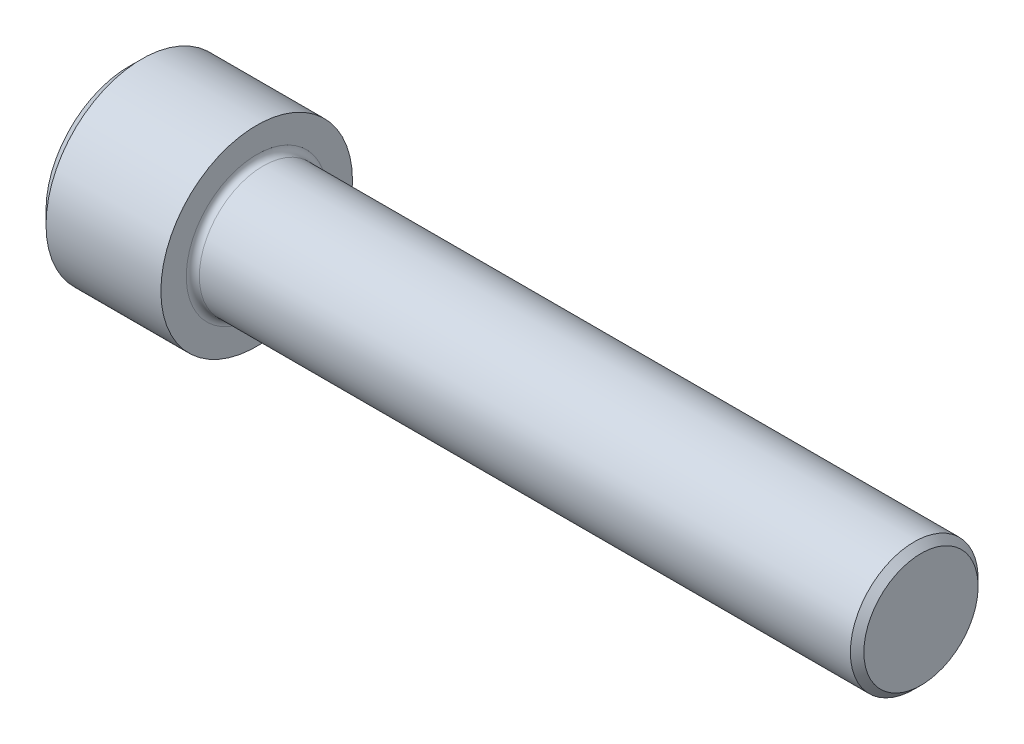
ISO-10303-21;
HEADER;
FILE_DESCRIPTION(('STEP AP214'),'2;1');
FILE_NAME('part.step','',(''),(''),'','','');
FILE_SCHEMA(('AUTOMOTIVE_DESIGN { 1 0 10303 214 1 1 1 1 }'));
ENDSEC;
DATA;
#1=APPLICATION_CONTEXT('core data for automotive mechanical design processes');
#2=APPLICATION_PROTOCOL_DEFINITION('international standard','automotive_design',2000,#1);
#3=PRODUCT_CONTEXT('',#1,'mechanical');
#4=PRODUCT('Part','Part','',(#3));
#5=PRODUCT_RELATED_PRODUCT_CATEGORY('part','',(#4));
#6=PRODUCT_DEFINITION_FORMATION('','',#4);
#7=PRODUCT_DEFINITION_CONTEXT('part definition',#1,'design');
#8=PRODUCT_DEFINITION('design','',#6,#7);
#9=PRODUCT_DEFINITION_SHAPE('','',#8);
#10=(LENGTH_UNIT() NAMED_UNIT(*) SI_UNIT(.MILLI.,.METRE.));
#11=(NAMED_UNIT(*) PLANE_ANGLE_UNIT() SI_UNIT($,.RADIAN.));
#12=(NAMED_UNIT(*) SI_UNIT($,.STERADIAN.) SOLID_ANGLE_UNIT());
#13=UNCERTAINTY_MEASURE_WITH_UNIT(LENGTH_MEASURE(1.E-05),#10,'distance_accuracy_value','');
#14=(GEOMETRIC_REPRESENTATION_CONTEXT(3) GLOBAL_UNCERTAINTY_ASSIGNED_CONTEXT((#13)) GLOBAL_UNIT_ASSIGNED_CONTEXT((#10,
#11,#12)) REPRESENTATION_CONTEXT('',''));
#15=CARTESIAN_POINT('',(0.,0.,0.));
#16=DIRECTION('',(0.,0.,1.));
#17=DIRECTION('',(1.,0.,0.));
#18=AXIS2_PLACEMENT_3D('',#15,#16,#17);
#19=CARTESIAN_POINT('',(0.,0.,0.));
#20=DIRECTION('',(-1.,0.,0.));
#21=DIRECTION('',(0.,0.,1.));
#22=AXIS2_PLACEMENT_3D('',#19,#20,#21);
#23=PLANE('',#22);
#24=DIRECTION('',(0.,-0.499999999999998,0.86602540378444));
#25=VECTOR('',#24,1.);
#26=CARTESIAN_POINT('',(0.,7.33234841870825,0.));
#27=LINE('',#26,#25);
#28=CARTESIAN_POINT('',(0.,7.33234841870825,0.));
#29=VERTEX_POINT('',#28);
#30=CARTESIAN_POINT('',(0.,3.66617420935414,6.34999999999999));
#31=VERTEX_POINT('',#30);
#32=EDGE_CURVE('E266',#29,#31,#27,.T.);
#33=ORIENTED_EDGE('',*,*,#32,.T.);
#34=DIRECTION('',(0.,1.,0.));
#35=VECTOR('',#34,1.);
#36=CARTESIAN_POINT('',(0.,-3.66617420935411,6.35));
#37=LINE('',#36,#35);
#38=CARTESIAN_POINT('',(0.,-3.66617420935411,6.35));
#39=VERTEX_POINT('',#38);
#40=EDGE_CURVE('E126',#39,#31,#37,.T.);
#41=ORIENTED_EDGE('',*,*,#40,.F.);
#42=DIRECTION('',(0.,-0.500000000000001,-0.866025403784438));
#43=VECTOR('',#42,1.);
#44=CARTESIAN_POINT('',(0.,-3.66617420935411,6.35));
#45=LINE('',#44,#43);
#46=CARTESIAN_POINT('',(0.,-7.33234841870823,0.));
#47=VERTEX_POINT('',#46);
#48=EDGE_CURVE('E269',#39,#47,#45,.T.);
#49=ORIENTED_EDGE('',*,*,#48,.T.);
#50=DIRECTION('',(0.,0.499999999999998,-0.86602540378444));
#51=VECTOR('',#50,1.);
#52=CARTESIAN_POINT('',(0.,-7.33234841870823,0.));
#53=LINE('',#52,#51);
#54=CARTESIAN_POINT('',(0.,-3.66617420935413,-6.35));
#55=VERTEX_POINT('',#54);
#56=EDGE_CURVE('E272',#47,#55,#53,.T.);
#57=ORIENTED_EDGE('',*,*,#56,.T.);
#58=DIRECTION('',(0.,-1.,0.));
#59=VECTOR('',#58,1.);
#60=CARTESIAN_POINT('',(0.,3.66617420935412,-6.35000000000001));
#61=LINE('',#60,#59);
#62=CARTESIAN_POINT('',(0.,3.66617420935412,-6.35000000000001));
#63=VERTEX_POINT('',#62);
#64=EDGE_CURVE('E275',#63,#55,#61,.T.);
#65=ORIENTED_EDGE('',*,*,#64,.F.);
#66=DIRECTION('',(0.,-0.500000000000001,-0.866025403784438));
#67=VECTOR('',#66,1.);
#68=CARTESIAN_POINT('',(0.,7.33234841870825,0.));
#69=LINE('',#68,#67);
#70=EDGE_CURVE('E121',#29,#63,#69,.T.);
#71=ORIENTED_EDGE('',*,*,#70,.F.);
#72=EDGE_LOOP('',(#33,#41,#49,#57,#65,#71));
#73=FACE_BOUND('',#72,.T.);
#74=CARTESIAN_POINT('',(0.,0.,0.));
#75=DIRECTION('',(-1.,0.,0.));
#76=DIRECTION('',(0.,0.,1.));
#77=AXIS2_PLACEMENT_3D('',#74,#75,#76);
#78=CIRCLE('',#77,10.30605);
#79=CARTESIAN_POINT('',(0.,0.,10.30605));
#80=VERTEX_POINT('',#79);
#81=EDGE_CURVE('E150',#80,#80,#78,.T.);
#82=ORIENTED_EDGE('',*,*,#81,.T.);
#83=EDGE_LOOP('',(#82));
#84=FACE_BOUND('',#83,.T.);
#85=ADVANCED_FACE('F34',(#73,#84),#23,.T.);
#86=CARTESIAN_POINT('',(0.,0.,0.));
#87=DIRECTION('',(1.,0.,0.));
#88=DIRECTION('',(0.,0.,-1.));
#89=AXIS2_PLACEMENT_3D('',#86,#87,#88);
#90=CONICAL_SURFACE('',#89,10.30605,0.785398163397448);
#91=CARTESIAN_POINT('',(1.6002,0.,0.));
#92=DIRECTION('',(-1.,0.,0.));
#93=DIRECTION('',(0.,0.,1.));
#94=AXIS2_PLACEMENT_3D('',#91,#92,#93);
#95=CIRCLE('',#94,11.90625);
#96=CARTESIAN_POINT('',(1.6002,0.,11.90625));
#97=VERTEX_POINT('',#96);
#98=EDGE_CURVE('E147',#97,#97,#95,.T.);
#99=ORIENTED_EDGE('',*,*,#98,.T.);
#100=EDGE_LOOP('',(#99));
#101=FACE_BOUND('',#100,.T.);
#102=ORIENTED_EDGE('',*,*,#81,.F.);
#103=EDGE_LOOP('',(#102));
#104=FACE_BOUND('',#103,.T.);
#105=ADVANCED_FACE('F171',(#101,#104),#90,.T.);
#106=CARTESIAN_POINT('',(-31.75,0.,0.));
#107=DIRECTION('',(-1.,0.,0.));
#108=DIRECTION('',(0.,0.,1.));
#109=AXIS2_PLACEMENT_3D('',#106,#107,#108);
#110=CYLINDRICAL_SURFACE('',#109,11.90625);
#111=CARTESIAN_POINT('',(15.875,0.,0.));
#112=DIRECTION('',(-1.,0.,0.));
#113=DIRECTION('',(0.,0.,1.));
#114=AXIS2_PLACEMENT_3D('',#111,#112,#113);
#115=CIRCLE('',#114,11.90625);
#116=CARTESIAN_POINT('',(15.875,0.,11.90625));
#117=VERTEX_POINT('',#116);
#118=EDGE_CURVE('E144',#117,#117,#115,.T.);
#119=ORIENTED_EDGE('',*,*,#118,.T.);
#120=EDGE_LOOP('',(#119));
#121=FACE_BOUND('',#120,.T.);
#122=ORIENTED_EDGE('',*,*,#98,.F.);
#123=EDGE_LOOP('',(#122));
#124=FACE_BOUND('',#123,.T.);
#125=ADVANCED_FACE('F176',(#121,#124),#110,.T.);
#126=CARTESIAN_POINT('',(15.875,11.90625,0.));
#127=DIRECTION('',(1.,0.,0.));
#128=DIRECTION('',(0.,0.,-1.));
#129=AXIS2_PLACEMENT_3D('',#126,#127,#128);
#130=PLANE('',#129);
#131=CARTESIAN_POINT('',(15.875,0.,0.));
#132=DIRECTION('',(1.,0.,0.));
#133=DIRECTION('',(0.,0.,-1.));
#134=AXIS2_PLACEMENT_3D('',#131,#132,#133);
#135=CIRCLE('',#134,8.75029999999994);
#136=CARTESIAN_POINT('',(15.875,0.,-8.75029999999994));
#137=VERTEX_POINT('',#136);
#138=EDGE_CURVE('E42',#137,#137,#135,.F.);
#139=ORIENTED_EDGE('',*,*,#138,.T.);
#140=EDGE_LOOP('',(#139));
#141=FACE_BOUND('',#140,.T.);
#142=ORIENTED_EDGE('',*,*,#118,.F.);
#143=EDGE_LOOP('',(#142));
#144=FACE_BOUND('',#143,.T.);
#145=ADVANCED_FACE('F155',(#141,#144),#130,.T.);
#146=CARTESIAN_POINT('',(-31.75,0.,0.));
#147=DIRECTION('',(-1.,0.,0.));
#148=DIRECTION('',(0.,0.,1.));
#149=AXIS2_PLACEMENT_3D('',#146,#147,#148);
#150=CYLINDRICAL_SURFACE('',#149,7.93749999999994);
#151=CARTESIAN_POINT('',(16.6878,0.,0.));
#152=DIRECTION('',(1.,0.,0.));
#153=DIRECTION('',(0.,0.,-1.));
#154=AXIS2_PLACEMENT_3D('',#151,#152,#153);
#155=CIRCLE('',#154,7.93749999999994);
#156=CARTESIAN_POINT('',(16.6878,0.,-7.93749999999994));
#157=VERTEX_POINT('',#156);
#158=EDGE_CURVE('E11',#157,#157,#155,.T.);
#159=ORIENTED_EDGE('',*,*,#158,.T.);
#160=EDGE_LOOP('',(#159));
#161=FACE_BOUND('',#160,.T.);
#162=CARTESIAN_POINT('',(97.5855299999999,0.,0.));
#163=DIRECTION('',(-1.,0.,0.));
#164=DIRECTION('',(0.,0.,1.));
#165=AXIS2_PLACEMENT_3D('',#162,#163,#164);
#166=CIRCLE('',#165,7.93749999999988);
#167=CARTESIAN_POINT('',(97.5855299999999,0.,7.93749999999988));
#168=VERTEX_POINT('',#167);
#169=EDGE_CURVE('E141',#168,#168,#166,.T.);
#170=ORIENTED_EDGE('',*,*,#169,.T.);
#171=EDGE_LOOP('',(#170));
#172=FACE_BOUND('',#171,.T.);
#173=ADVANCED_FACE('F186',(#161,#172),#150,.T.);
#174=CARTESIAN_POINT('',(98.425,0.,0.));
#175=DIRECTION('',(-1.,0.,0.));
#176=DIRECTION('',(0.,0.,1.));
#177=AXIS2_PLACEMENT_3D('',#174,#175,#176);
#178=CONICAL_SURFACE('',#177,7.09803,0.785398163397321);
#179=ORIENTED_EDGE('',*,*,#169,.F.);
#180=EDGE_LOOP('',(#179));
#181=FACE_BOUND('',#180,.T.);
#182=CARTESIAN_POINT('',(98.425,0.,0.));
#183=DIRECTION('',(-1.,0.,0.));
#184=DIRECTION('',(0.,0.,1.));
#185=AXIS2_PLACEMENT_3D('',#182,#183,#184);
#186=CIRCLE('',#185,7.09803);
#187=CARTESIAN_POINT('',(98.425,0.,7.09803));
#188=VERTEX_POINT('',#187);
#189=EDGE_CURVE('E137',#188,#188,#186,.T.);
#190=ORIENTED_EDGE('',*,*,#189,.T.);
#191=EDGE_LOOP('',(#190));
#192=FACE_BOUND('',#191,.T.);
#193=ADVANCED_FACE('F166',(#181,#192),#178,.T.);
#194=CARTESIAN_POINT('',(98.425,7.09803,0.));
#195=DIRECTION('',(1.,0.,0.));
#196=DIRECTION('',(0.,0.,-1.));
#197=AXIS2_PLACEMENT_3D('',#194,#195,#196);
#198=PLANE('',#197);
#199=ORIENTED_EDGE('',*,*,#189,.F.);
#200=EDGE_LOOP('',(#199));
#201=FACE_BOUND('',#200,.T.);
#202=ADVANCED_FACE('F159',(#201),#198,.T.);
#203=CARTESIAN_POINT('',(16.6878,0.,0.));
#204=DIRECTION('',(1.,0.,0.));
#205=DIRECTION('',(0.,0.,-1.));
#206=AXIS2_PLACEMENT_3D('',#203,#204,#205);
#207=TOROIDAL_SURFACE('',#206,8.75029999999994,0.8128);
#208=ORIENTED_EDGE('',*,*,#158,.F.);
#209=EDGE_LOOP('',(#208));
#210=FACE_BOUND('',#209,.T.);
#211=ORIENTED_EDGE('',*,*,#138,.F.);
#212=EDGE_LOOP('',(#211));
#213=FACE_BOUND('',#212,.T.);
#214=ADVANCED_FACE('F36',(#210,#213),#207,.F.);
#215=CARTESIAN_POINT('',(7.7978,7.33234841870825,0.));
#216=DIRECTION('',(0.,-0.86602540378444,-0.499999999999998));
#217=DIRECTION('',(0.,0.499999999999998,-0.86602540378444));
#218=AXIS2_PLACEMENT_3D('',#215,#216,#217);
#219=PLANE('',#218);
#220=ORIENTED_EDGE('',*,*,#32,.F.);
#221=DIRECTION('',(-1.,0.,0.));
#222=VECTOR('',#221,1.);
#223=CARTESIAN_POINT('',(7.7978,7.33234841870825,0.));
#224=LINE('',#223,#222);
#225=CARTESIAN_POINT('',(7.7978,7.33234841870825,0.));
#226=VERTEX_POINT('',#225);
#227=EDGE_CURVE('E265',#226,#29,#224,.T.);
#228=ORIENTED_EDGE('',*,*,#227,.F.);
#229=DIRECTION('',(0.,-0.499999999999998,0.86602540378444));
#230=VECTOR('',#229,1.);
#231=CARTESIAN_POINT('',(7.7978,7.33234841870825,0.));
#232=LINE('',#231,#230);
#233=CARTESIAN_POINT('',(7.7978,5.49926131403119,3.17499999999999));
#234=VERTEX_POINT('',#233);
#235=EDGE_CURVE('E49',#226,#234,#232,.T.);
#236=ORIENTED_EDGE('',*,*,#235,.T.);
#237=CARTESIAN_POINT('',(7.7978,3.66617420935414,6.34999999999999));
#238=VERTEX_POINT('',#237);
#239=EDGE_CURVE('E107',#234,#238,#232,.T.);
#240=ORIENTED_EDGE('',*,*,#239,.T.);
#241=DIRECTION('',(-1.,0.,0.));
#242=VECTOR('',#241,1.);
#243=CARTESIAN_POINT('',(7.7978,3.66617420935414,6.34999999999999));
#244=LINE('',#243,#242);
#245=EDGE_CURVE('E119',#238,#31,#244,.T.);
#246=ORIENTED_EDGE('',*,*,#245,.T.);
#247=EDGE_LOOP('',(#220,#228,#236,#240,#246));
#248=FACE_BOUND('',#247,.T.);
#249=ADVANCED_FACE('F118',(#248),#219,.T.);
#250=CARTESIAN_POINT('',(7.7978,-3.66617420935411,6.35));
#251=DIRECTION('',(0.,0.,1.));
#252=DIRECTION('',(0.,-1.,0.));
#253=AXIS2_PLACEMENT_3D('',#250,#251,#252);
#254=PLANE('',#253);
#255=ORIENTED_EDGE('',*,*,#40,.T.);
#256=ORIENTED_EDGE('',*,*,#245,.F.);
#257=DIRECTION('',(0.,1.,0.));
#258=VECTOR('',#257,1.);
#259=CARTESIAN_POINT('',(7.7978,-3.66617420935411,6.35));
#260=LINE('',#259,#258);
#261=CARTESIAN_POINT('',(7.7978,0.,6.34999999999999));
#262=VERTEX_POINT('',#261);
#263=EDGE_CURVE('E105',#262,#238,#260,.T.);
#264=ORIENTED_EDGE('',*,*,#263,.F.);
#265=CARTESIAN_POINT('',(7.7978,-3.66617420935411,6.35));
#266=VERTEX_POINT('',#265);
#267=EDGE_CURVE('E115',#266,#262,#260,.T.);
#268=ORIENTED_EDGE('',*,*,#267,.F.);
#269=DIRECTION('',(-1.,0.,0.));
#270=VECTOR('',#269,1.);
#271=CARTESIAN_POINT('',(7.7978,-3.66617420935411,6.35));
#272=LINE('',#271,#270);
#273=EDGE_CURVE('E128',#266,#39,#272,.T.);
#274=ORIENTED_EDGE('',*,*,#273,.T.);
#275=EDGE_LOOP('',(#255,#256,#264,#268,#274));
#276=FACE_BOUND('',#275,.T.);
#277=ADVANCED_FACE('F123',(#276),#254,.F.);
#278=CARTESIAN_POINT('',(7.7978,-3.66617420935411,6.35));
#279=DIRECTION('',(0.,0.866025403784438,-0.500000000000001));
#280=DIRECTION('',(0.,0.500000000000001,0.866025403784438));
#281=AXIS2_PLACEMENT_3D('',#278,#279,#280);
#282=PLANE('',#281);
#283=ORIENTED_EDGE('',*,*,#48,.F.);
#284=ORIENTED_EDGE('',*,*,#273,.F.);
#285=DIRECTION('',(0.,-0.500000000000001,-0.866025403784438));
#286=VECTOR('',#285,1.);
#287=CARTESIAN_POINT('',(7.7978,-3.66617420935411,6.35));
#288=LINE('',#287,#286);
#289=CARTESIAN_POINT('',(7.7978,-5.49926131403117,3.175));
#290=VERTEX_POINT('',#289);
#291=EDGE_CURVE('E246',#266,#290,#288,.T.);
#292=ORIENTED_EDGE('',*,*,#291,.T.);
#293=CARTESIAN_POINT('',(7.7978,-7.33234841870823,0.));
#294=VERTEX_POINT('',#293);
#295=EDGE_CURVE('E248',#290,#294,#288,.T.);
#296=ORIENTED_EDGE('',*,*,#295,.T.);
#297=DIRECTION('',(-1.,0.,0.));
#298=VECTOR('',#297,1.);
#299=CARTESIAN_POINT('',(7.7978,-7.33234841870823,0.));
#300=LINE('',#299,#298);
#301=EDGE_CURVE('E133',#294,#47,#300,.T.);
#302=ORIENTED_EDGE('',*,*,#301,.T.);
#303=EDGE_LOOP('',(#283,#284,#292,#296,#302));
#304=FACE_BOUND('',#303,.T.);
#305=ADVANCED_FACE('F198',(#304),#282,.T.);
#306=CARTESIAN_POINT('',(7.7978,-7.33234841870823,0.));
#307=DIRECTION('',(0.,0.86602540378444,0.499999999999998));
#308=DIRECTION('',(0.,-0.499999999999998,0.86602540378444));
#309=AXIS2_PLACEMENT_3D('',#306,#307,#308);
#310=PLANE('',#309);
#311=ORIENTED_EDGE('',*,*,#56,.F.);
#312=ORIENTED_EDGE('',*,*,#301,.F.);
#313=DIRECTION('',(0.,0.499999999999998,-0.86602540378444));
#314=VECTOR('',#313,1.);
#315=CARTESIAN_POINT('',(7.7978,-7.33234841870823,0.));
#316=LINE('',#315,#314);
#317=CARTESIAN_POINT('',(7.7978,-5.49926131403119,-3.17499999999999));
#318=VERTEX_POINT('',#317);
#319=EDGE_CURVE('E251',#294,#318,#316,.T.);
#320=ORIENTED_EDGE('',*,*,#319,.T.);
#321=CARTESIAN_POINT('',(7.7978,-3.66617420935413,-6.35));
#322=VERTEX_POINT('',#321);
#323=EDGE_CURVE('E255',#318,#322,#316,.T.);
#324=ORIENTED_EDGE('',*,*,#323,.T.);
#325=DIRECTION('',(-1.,0.,0.));
#326=VECTOR('',#325,1.);
#327=CARTESIAN_POINT('',(7.7978,-3.66617420935413,-6.35));
#328=LINE('',#327,#326);
#329=EDGE_CURVE('E284',#322,#55,#328,.T.);
#330=ORIENTED_EDGE('',*,*,#329,.T.);
#331=EDGE_LOOP('',(#311,#312,#320,#324,#330));
#332=FACE_BOUND('',#331,.T.);
#333=ADVANCED_FACE('F201',(#332),#310,.T.);
#334=CARTESIAN_POINT('',(7.7978,3.66617420935412,-6.35000000000001));
#335=DIRECTION('',(0.,0.,-1.));
#336=DIRECTION('',(0.,1.,0.));
#337=AXIS2_PLACEMENT_3D('',#334,#335,#336);
#338=PLANE('',#337);
#339=ORIENTED_EDGE('',*,*,#64,.T.);
#340=ORIENTED_EDGE('',*,*,#329,.F.);
#341=DIRECTION('',(0.,-1.,0.));
#342=VECTOR('',#341,1.);
#343=CARTESIAN_POINT('',(7.7978,3.66617420935412,-6.35000000000001));
#344=LINE('',#343,#342);
#345=CARTESIAN_POINT('',(7.7978,0.,-6.35));
#346=VERTEX_POINT('',#345);
#347=EDGE_CURVE('E259',#346,#322,#344,.T.);
#348=ORIENTED_EDGE('',*,*,#347,.F.);
#349=CARTESIAN_POINT('',(7.7978,3.66617420935412,-6.35000000000001));
#350=VERTEX_POINT('',#349);
#351=EDGE_CURVE('E260',#350,#346,#344,.T.);
#352=ORIENTED_EDGE('',*,*,#351,.F.);
#353=DIRECTION('',(-1.,0.,0.));
#354=VECTOR('',#353,1.);
#355=CARTESIAN_POINT('',(7.7978,3.66617420935412,-6.35000000000001));
#356=LINE('',#355,#354);
#357=EDGE_CURVE('E281',#350,#63,#356,.T.);
#358=ORIENTED_EDGE('',*,*,#357,.T.);
#359=EDGE_LOOP('',(#339,#340,#348,#352,#358));
#360=FACE_BOUND('',#359,.T.);
#361=ADVANCED_FACE('F205',(#360),#338,.F.);
#362=CARTESIAN_POINT('',(7.7978,7.33234841870825,0.));
#363=DIRECTION('',(0.,0.866025403784438,-0.500000000000001));
#364=DIRECTION('',(0.,0.500000000000001,0.866025403784438));
#365=AXIS2_PLACEMENT_3D('',#362,#363,#364);
#366=PLANE('',#365);
#367=ORIENTED_EDGE('',*,*,#70,.T.);
#368=ORIENTED_EDGE('',*,*,#357,.F.);
#369=DIRECTION('',(0.,-0.500000000000001,-0.866025403784438));
#370=VECTOR('',#369,1.);
#371=CARTESIAN_POINT('',(7.7978,7.33234841870825,0.));
#372=LINE('',#371,#370);
#373=CARTESIAN_POINT('',(7.7978,5.49926131403118,-3.17500000000001));
#374=VERTEX_POINT('',#373);
#375=EDGE_CURVE('E263',#374,#350,#372,.T.);
#376=ORIENTED_EDGE('',*,*,#375,.F.);
#377=EDGE_CURVE('E237',#226,#374,#372,.T.);
#378=ORIENTED_EDGE('',*,*,#377,.F.);
#379=ORIENTED_EDGE('',*,*,#227,.T.);
#380=EDGE_LOOP('',(#367,#368,#376,#378,#379));
#381=FACE_BOUND('',#380,.T.);
#382=ADVANCED_FACE('F209',(#381),#366,.F.);
#383=CARTESIAN_POINT('',(7.7978,3.66617420935414,6.34999999999999));
#384=DIRECTION('',(-1.,0.,0.));
#385=DIRECTION('',(0.,0.,1.));
#386=AXIS2_PLACEMENT_3D('',#383,#384,#385);
#387=PLANE('',#386);
#388=CARTESIAN_POINT('',(7.7978,0.,0.));
#389=DIRECTION('',(-1.,0.,0.));
#390=DIRECTION('',(0.,0.,1.));
#391=AXIS2_PLACEMENT_3D('',#388,#389,#390);
#392=CIRCLE('',#391,6.35);
#393=EDGE_CURVE('E127',#290,#262,#392,.T.);
#394=ORIENTED_EDGE('',*,*,#393,.F.);
#395=ORIENTED_EDGE('',*,*,#291,.F.);
#396=ORIENTED_EDGE('',*,*,#267,.T.);
#397=EDGE_LOOP('',(#394,#395,#396));
#398=FACE_BOUND('',#397,.T.);
#399=ADVANCED_FACE('F213',(#398),#387,.T.);
#400=EDGE_CURVE('E131',#318,#290,#392,.T.);
#401=ORIENTED_EDGE('',*,*,#400,.F.);
#402=ORIENTED_EDGE('',*,*,#319,.F.);
#403=ORIENTED_EDGE('',*,*,#295,.F.);
#404=EDGE_LOOP('',(#401,#402,#403));
#405=FACE_BOUND('',#404,.T.);
#406=ADVANCED_FACE('F216',(#405),#387,.T.);
#407=EDGE_CURVE('E290',#346,#318,#392,.T.);
#408=ORIENTED_EDGE('',*,*,#407,.F.);
#409=ORIENTED_EDGE('',*,*,#347,.T.);
#410=ORIENTED_EDGE('',*,*,#323,.F.);
#411=EDGE_LOOP('',(#408,#409,#410));
#412=FACE_BOUND('',#411,.T.);
#413=ADVANCED_FACE('F221',(#412),#387,.T.);
#414=EDGE_CURVE('E240',#374,#346,#392,.T.);
#415=ORIENTED_EDGE('',*,*,#414,.F.);
#416=ORIENTED_EDGE('',*,*,#375,.T.);
#417=ORIENTED_EDGE('',*,*,#351,.T.);
#418=EDGE_LOOP('',(#415,#416,#417));
#419=FACE_BOUND('',#418,.T.);
#420=ADVANCED_FACE('F228',(#419),#387,.T.);
#421=EDGE_CURVE('E138',#234,#374,#392,.T.);
#422=ORIENTED_EDGE('',*,*,#421,.F.);
#423=ORIENTED_EDGE('',*,*,#235,.F.);
#424=ORIENTED_EDGE('',*,*,#377,.T.);
#425=EDGE_LOOP('',(#422,#423,#424));
#426=FACE_BOUND('',#425,.T.);
#427=ADVANCED_FACE('F224',(#426),#387,.T.);
#428=EDGE_CURVE('E110',#262,#234,#392,.T.);
#429=ORIENTED_EDGE('',*,*,#428,.F.);
#430=ORIENTED_EDGE('',*,*,#263,.T.);
#431=ORIENTED_EDGE('',*,*,#239,.F.);
#432=EDGE_LOOP('',(#429,#430,#431));
#433=FACE_BOUND('',#432,.T.);
#434=ADVANCED_FACE('F106',(#433),#387,.T.);
#435=CARTESIAN_POINT('',(7.7978,0.,0.));
#436=DIRECTION('',(-1.,0.,0.));
#437=DIRECTION('',(0.,0.,1.));
#438=AXIS2_PLACEMENT_3D('',#435,#436,#437);
#439=CONICAL_SURFACE('',#438,6.35,1.04719755119659);
#440=CARTESIAN_POINT('',(11.4639742093542,0.,0.));
#441=VERTEX_POINT('',#440);
#442=VERTEX_LOOP('',#441);
#443=FACE_BOUND('',#442,.T.);
#444=ORIENTED_EDGE('',*,*,#428,.T.);
#445=ORIENTED_EDGE('',*,*,#421,.T.);
#446=ORIENTED_EDGE('',*,*,#414,.T.);
#447=ORIENTED_EDGE('',*,*,#407,.T.);
#448=ORIENTED_EDGE('',*,*,#400,.T.);
#449=ORIENTED_EDGE('',*,*,#393,.T.);
#450=EDGE_LOOP('',(#444,#445,#446,#447,#448,#449));
#451=FACE_BOUND('',#450,.T.);
#452=ADVANCED_FACE('F193',(#443,#451),#439,.F.);
#453=CLOSED_SHELL('',(#85,#105,#125,#145,#173,#193,#202,#214,#249,#277,#305,#333,#361,#382,#399,
#406,#413,#420,#427,#434,#452));
#454=MANIFOLD_SOLID_BREP('B2',#453);
#455=ADVANCED_BREP_SHAPE_REPRESENTATION('',(#18,#454),#14);
#456=SHAPE_DEFINITION_REPRESENTATION(#9,#455);
ENDSEC;
END-ISO-10303-21;
